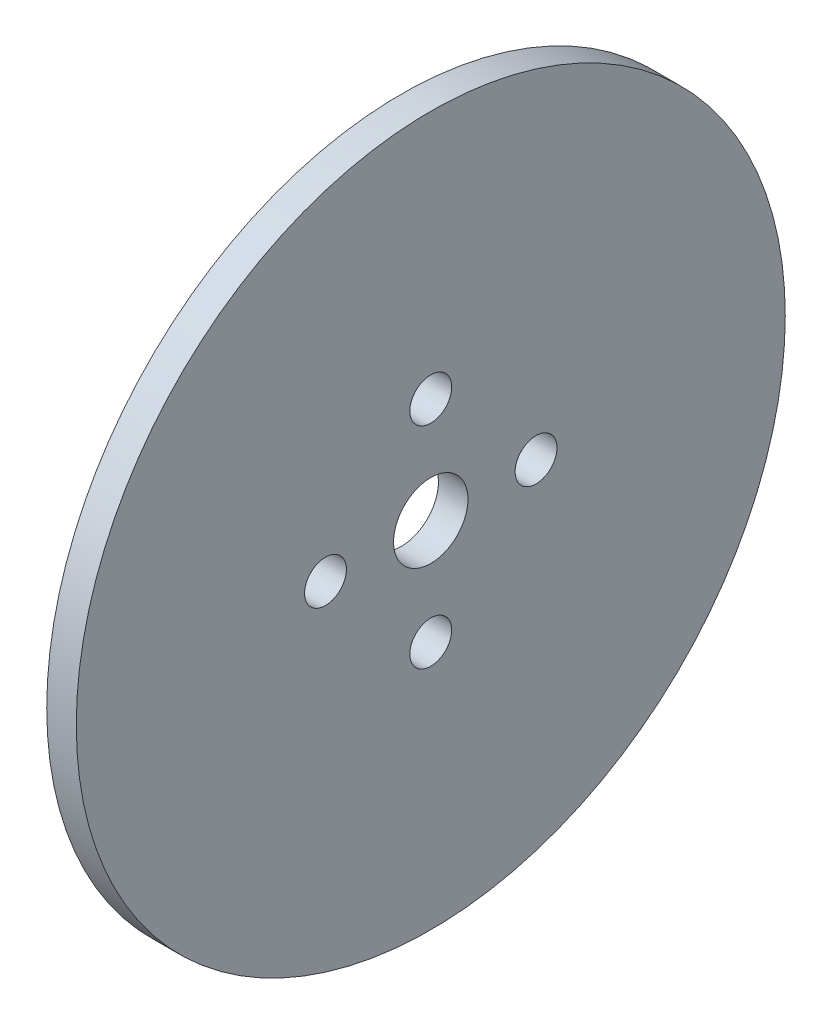
ISO-10303-21;
HEADER;
FILE_DESCRIPTION(('STEP AP214'),'2;1');
FILE_NAME('part.step','',(''),(''),'','','');
FILE_SCHEMA(('AUTOMOTIVE_DESIGN { 1 0 10303 214 1 1 1 1 }'));
ENDSEC;
DATA;
#1=APPLICATION_CONTEXT('core data for automotive mechanical design processes');
#2=APPLICATION_PROTOCOL_DEFINITION('international standard','automotive_design',2000,#1);
#3=PRODUCT_CONTEXT('',#1,'mechanical');
#4=PRODUCT('Part','Part','',(#3));
#5=PRODUCT_RELATED_PRODUCT_CATEGORY('part','',(#4));
#6=PRODUCT_DEFINITION_FORMATION('','',#4);
#7=PRODUCT_DEFINITION_CONTEXT('part definition',#1,'design');
#8=PRODUCT_DEFINITION('design','',#6,#7);
#9=PRODUCT_DEFINITION_SHAPE('','',#8);
#10=(LENGTH_UNIT() NAMED_UNIT(*) SI_UNIT(.MILLI.,.METRE.));
#11=(NAMED_UNIT(*) PLANE_ANGLE_UNIT() SI_UNIT($,.RADIAN.));
#12=(NAMED_UNIT(*) SI_UNIT($,.STERADIAN.) SOLID_ANGLE_UNIT());
#13=UNCERTAINTY_MEASURE_WITH_UNIT(LENGTH_MEASURE(1.E-05),#10,'distance_accuracy_value','');
#14=(GEOMETRIC_REPRESENTATION_CONTEXT(3) GLOBAL_UNCERTAINTY_ASSIGNED_CONTEXT((#13)) GLOBAL_UNIT_ASSIGNED_CONTEXT((#10,
#11,#12)) REPRESENTATION_CONTEXT('',''));
#15=CARTESIAN_POINT('',(0.,0.,0.));
#16=DIRECTION('',(0.,0.,1.));
#17=DIRECTION('',(1.,0.,0.));
#18=AXIS2_PLACEMENT_3D('',#15,#16,#17);
#19=CARTESIAN_POINT('',(3.175,0.,0.));
#20=DIRECTION('',(1.,0.,0.));
#21=DIRECTION('',(0.,0.,-1.));
#22=AXIS2_PLACEMENT_3D('',#19,#20,#21);
#23=PLANE('',#22);
#24=CARTESIAN_POINT('',(3.175,0.,11.3137084989848));
#25=DIRECTION('',(1.,0.,0.));
#26=DIRECTION('',(0.,0.,-1.));
#27=AXIS2_PLACEMENT_3D('',#24,#25,#26);
#28=CIRCLE('',#27,2.25);
#29=CARTESIAN_POINT('',(3.175,0.,9.06370849898475));
#30=VERTEX_POINT('',#29);
#31=EDGE_CURVE('E60',#30,#30,#28,.T.);
#32=ORIENTED_EDGE('',*,*,#31,.F.);
#33=EDGE_LOOP('',(#32));
#34=FACE_BOUND('',#33,.T.);
#35=CARTESIAN_POINT('',(3.175,11.3137084989848,0.));
#36=DIRECTION('',(1.,0.,0.));
#37=DIRECTION('',(0.,0.,-1.));
#38=AXIS2_PLACEMENT_3D('',#35,#36,#37);
#39=CIRCLE('',#38,2.25);
#40=CARTESIAN_POINT('',(3.175,11.3137084989848,-2.25000000000001));
#41=VERTEX_POINT('',#40);
#42=EDGE_CURVE('E82',#41,#41,#39,.T.);
#43=ORIENTED_EDGE('',*,*,#42,.F.);
#44=EDGE_LOOP('',(#43));
#45=FACE_BOUND('',#44,.T.);
#46=CARTESIAN_POINT('',(3.175,-11.3137084989848,0.));
#47=DIRECTION('',(1.,0.,0.));
#48=DIRECTION('',(0.,0.,-1.));
#49=AXIS2_PLACEMENT_3D('',#46,#47,#48);
#50=CIRCLE('',#49,2.25);
#51=CARTESIAN_POINT('',(3.175,-11.3137084989848,-2.25));
#52=VERTEX_POINT('',#51);
#53=EDGE_CURVE('E79',#52,#52,#50,.T.);
#54=ORIENTED_EDGE('',*,*,#53,.F.);
#55=EDGE_LOOP('',(#54));
#56=FACE_BOUND('',#55,.T.);
#57=CARTESIAN_POINT('',(3.175,0.,-11.3137084989848));
#58=DIRECTION('',(1.,0.,0.));
#59=DIRECTION('',(0.,0.,-1.));
#60=AXIS2_PLACEMENT_3D('',#57,#58,#59);
#61=CIRCLE('',#60,2.25);
#62=CARTESIAN_POINT('',(3.175,0.,-13.5637084989848));
#63=VERTEX_POINT('',#62);
#64=EDGE_CURVE('E76',#63,#63,#61,.T.);
#65=ORIENTED_EDGE('',*,*,#64,.F.);
#66=EDGE_LOOP('',(#65));
#67=FACE_BOUND('',#66,.T.);
#68=CARTESIAN_POINT('',(3.175,0.,0.));
#69=DIRECTION('',(1.,0.,0.));
#70=DIRECTION('',(0.,0.,-1.));
#71=AXIS2_PLACEMENT_3D('',#68,#69,#70);
#72=CIRCLE('',#71,38.1);
#73=CARTESIAN_POINT('',(3.175,0.,-38.1));
#74=VERTEX_POINT('',#73);
#75=EDGE_CURVE('E10',#74,#74,#72,.T.);
#76=ORIENTED_EDGE('',*,*,#75,.T.);
#77=EDGE_LOOP('',(#76));
#78=FACE_BOUND('',#77,.T.);
#79=CARTESIAN_POINT('',(3.175,0.,0.));
#80=DIRECTION('',(1.,0.,0.));
#81=DIRECTION('',(0.,0.,-1.));
#82=AXIS2_PLACEMENT_3D('',#79,#80,#81);
#83=CIRCLE('',#82,4.);
#84=CARTESIAN_POINT('',(3.175,0.,-4.));
#85=VERTEX_POINT('',#84);
#86=EDGE_CURVE('E50',#85,#85,#83,.T.);
#87=ORIENTED_EDGE('',*,*,#86,.F.);
#88=EDGE_LOOP('',(#87));
#89=FACE_BOUND('',#88,.T.);
#90=ADVANCED_FACE('F37',(#34,#45,#56,#67,#78,#89),#23,.T.);
#91=CARTESIAN_POINT('',(0.,0.,0.));
#92=DIRECTION('',(1.,0.,0.));
#93=DIRECTION('',(0.,0.,-1.));
#94=AXIS2_PLACEMENT_3D('',#91,#92,#93);
#95=PLANE('',#94);
#96=CARTESIAN_POINT('',(0.,0.,11.3137084989848));
#97=DIRECTION('',(1.,0.,0.));
#98=DIRECTION('',(0.,0.,-1.));
#99=AXIS2_PLACEMENT_3D('',#96,#97,#98);
#100=CIRCLE('',#99,2.25);
#101=CARTESIAN_POINT('',(0.,0.,9.06370849898475));
#102=VERTEX_POINT('',#101);
#103=EDGE_CURVE('E41',#102,#102,#100,.T.);
#104=ORIENTED_EDGE('',*,*,#103,.T.);
#105=EDGE_LOOP('',(#104));
#106=FACE_BOUND('',#105,.T.);
#107=CARTESIAN_POINT('',(0.,11.3137084989848,0.));
#108=DIRECTION('',(1.,0.,0.));
#109=DIRECTION('',(0.,0.,-1.));
#110=AXIS2_PLACEMENT_3D('',#107,#108,#109);
#111=CIRCLE('',#110,2.25);
#112=CARTESIAN_POINT('',(0.,11.3137084989848,-2.25000000000001));
#113=VERTEX_POINT('',#112);
#114=EDGE_CURVE('E62',#113,#113,#111,.T.);
#115=ORIENTED_EDGE('',*,*,#114,.T.);
#116=EDGE_LOOP('',(#115));
#117=FACE_BOUND('',#116,.T.);
#118=CARTESIAN_POINT('',(0.,-11.3137084989848,0.));
#119=DIRECTION('',(1.,0.,0.));
#120=DIRECTION('',(0.,0.,-1.));
#121=AXIS2_PLACEMENT_3D('',#118,#119,#120);
#122=CIRCLE('',#121,2.25);
#123=CARTESIAN_POINT('',(0.,-11.3137084989848,-2.25));
#124=VERTEX_POINT('',#123);
#125=EDGE_CURVE('E59',#124,#124,#122,.T.);
#126=ORIENTED_EDGE('',*,*,#125,.T.);
#127=EDGE_LOOP('',(#126));
#128=FACE_BOUND('',#127,.T.);
#129=CARTESIAN_POINT('',(0.,0.,-11.3137084989848));
#130=DIRECTION('',(1.,0.,0.));
#131=DIRECTION('',(0.,0.,-1.));
#132=AXIS2_PLACEMENT_3D('',#129,#130,#131);
#133=CIRCLE('',#132,2.25);
#134=CARTESIAN_POINT('',(0.,0.,-13.5637084989848));
#135=VERTEX_POINT('',#134);
#136=EDGE_CURVE('E56',#135,#135,#133,.T.);
#137=ORIENTED_EDGE('',*,*,#136,.T.);
#138=EDGE_LOOP('',(#137));
#139=FACE_BOUND('',#138,.T.);
#140=CARTESIAN_POINT('',(0.,0.,0.));
#141=DIRECTION('',(1.,0.,0.));
#142=DIRECTION('',(0.,0.,-1.));
#143=AXIS2_PLACEMENT_3D('',#140,#141,#142);
#144=CIRCLE('',#143,38.1);
#145=CARTESIAN_POINT('',(0.,0.,-38.1));
#146=VERTEX_POINT('',#145);
#147=EDGE_CURVE('E45',#146,#146,#144,.T.);
#148=ORIENTED_EDGE('',*,*,#147,.F.);
#149=EDGE_LOOP('',(#148));
#150=FACE_BOUND('',#149,.T.);
#151=CARTESIAN_POINT('',(0.,0.,0.));
#152=DIRECTION('',(1.,0.,0.));
#153=DIRECTION('',(0.,0.,-1.));
#154=AXIS2_PLACEMENT_3D('',#151,#152,#153);
#155=CIRCLE('',#154,4.);
#156=CARTESIAN_POINT('',(0.,0.,-4.));
#157=VERTEX_POINT('',#156);
#158=EDGE_CURVE('E53',#157,#157,#155,.T.);
#159=ORIENTED_EDGE('',*,*,#158,.T.);
#160=EDGE_LOOP('',(#159));
#161=FACE_BOUND('',#160,.T.);
#162=ADVANCED_FACE('F93',(#106,#117,#128,#139,#150,#161),#95,.F.);
#163=CARTESIAN_POINT('',(3.175,0.,0.));
#164=DIRECTION('',(-1.,0.,0.));
#165=DIRECTION('',(0.,0.,1.));
#166=AXIS2_PLACEMENT_3D('',#163,#164,#165);
#167=CYLINDRICAL_SURFACE('',#166,38.1);
#168=ORIENTED_EDGE('',*,*,#75,.F.);
#169=EDGE_LOOP('',(#168));
#170=FACE_BOUND('',#169,.T.);
#171=ORIENTED_EDGE('',*,*,#147,.T.);
#172=EDGE_LOOP('',(#171));
#173=FACE_BOUND('',#172,.T.);
#174=ADVANCED_FACE('F39',(#170,#173),#167,.T.);
#175=CARTESIAN_POINT('',(3.175,0.,0.));
#176=DIRECTION('',(-1.,0.,0.));
#177=DIRECTION('',(0.,0.,1.));
#178=AXIS2_PLACEMENT_3D('',#175,#176,#177);
#179=CYLINDRICAL_SURFACE('',#178,4.);
#180=ORIENTED_EDGE('',*,*,#86,.T.);
#181=EDGE_LOOP('',(#180));
#182=FACE_BOUND('',#181,.T.);
#183=ORIENTED_EDGE('',*,*,#158,.F.);
#184=EDGE_LOOP('',(#183));
#185=FACE_BOUND('',#184,.T.);
#186=ADVANCED_FACE('F106',(#182,#185),#179,.F.);
#187=CARTESIAN_POINT('',(-27.219,0.,-11.3137084989848));
#188=DIRECTION('',(1.,0.,0.));
#189=DIRECTION('',(0.,0.,-1.));
#190=AXIS2_PLACEMENT_3D('',#187,#188,#189);
#191=CYLINDRICAL_SURFACE('',#190,2.25);
#192=ORIENTED_EDGE('',*,*,#64,.T.);
#193=EDGE_LOOP('',(#192));
#194=FACE_BOUND('',#193,.T.);
#195=ORIENTED_EDGE('',*,*,#136,.F.);
#196=EDGE_LOOP('',(#195));
#197=FACE_BOUND('',#196,.T.);
#198=ADVANCED_FACE('F102',(#194,#197),#191,.F.);
#199=CARTESIAN_POINT('',(-27.219,-11.3137084989848,0.));
#200=DIRECTION('',(1.,0.,0.));
#201=DIRECTION('',(0.,0.,-1.));
#202=AXIS2_PLACEMENT_3D('',#199,#200,#201);
#203=CYLINDRICAL_SURFACE('',#202,2.25);
#204=ORIENTED_EDGE('',*,*,#53,.T.);
#205=EDGE_LOOP('',(#204));
#206=FACE_BOUND('',#205,.T.);
#207=ORIENTED_EDGE('',*,*,#125,.F.);
#208=EDGE_LOOP('',(#207));
#209=FACE_BOUND('',#208,.T.);
#210=ADVANCED_FACE('F105',(#206,#209),#203,.F.);
#211=CARTESIAN_POINT('',(-27.219,11.3137084989848,0.));
#212=DIRECTION('',(1.,0.,0.));
#213=DIRECTION('',(0.,0.,-1.));
#214=AXIS2_PLACEMENT_3D('',#211,#212,#213);
#215=CYLINDRICAL_SURFACE('',#214,2.25);
#216=ORIENTED_EDGE('',*,*,#42,.T.);
#217=EDGE_LOOP('',(#216));
#218=FACE_BOUND('',#217,.T.);
#219=ORIENTED_EDGE('',*,*,#114,.F.);
#220=EDGE_LOOP('',(#219));
#221=FACE_BOUND('',#220,.T.);
#222=ADVANCED_FACE('F126',(#218,#221),#215,.F.);
#223=CARTESIAN_POINT('',(-27.219,0.,11.3137084989848));
#224=DIRECTION('',(1.,0.,0.));
#225=DIRECTION('',(0.,0.,-1.));
#226=AXIS2_PLACEMENT_3D('',#223,#224,#225);
#227=CYLINDRICAL_SURFACE('',#226,2.25);
#228=ORIENTED_EDGE('',*,*,#31,.T.);
#229=EDGE_LOOP('',(#228));
#230=FACE_BOUND('',#229,.T.);
#231=ORIENTED_EDGE('',*,*,#103,.F.);
#232=EDGE_LOOP('',(#231));
#233=FACE_BOUND('',#232,.T.);
#234=ADVANCED_FACE('F88',(#230,#233),#227,.F.);
#235=CLOSED_SHELL('',(#90,#162,#174,#186,#198,#210,#222,#234));
#236=MANIFOLD_SOLID_BREP('B2',#235);
#237=ADVANCED_BREP_SHAPE_REPRESENTATION('',(#18,#236),#14);
#238=SHAPE_DEFINITION_REPRESENTATION(#9,#237);
ENDSEC;
END-ISO-10303-21;
